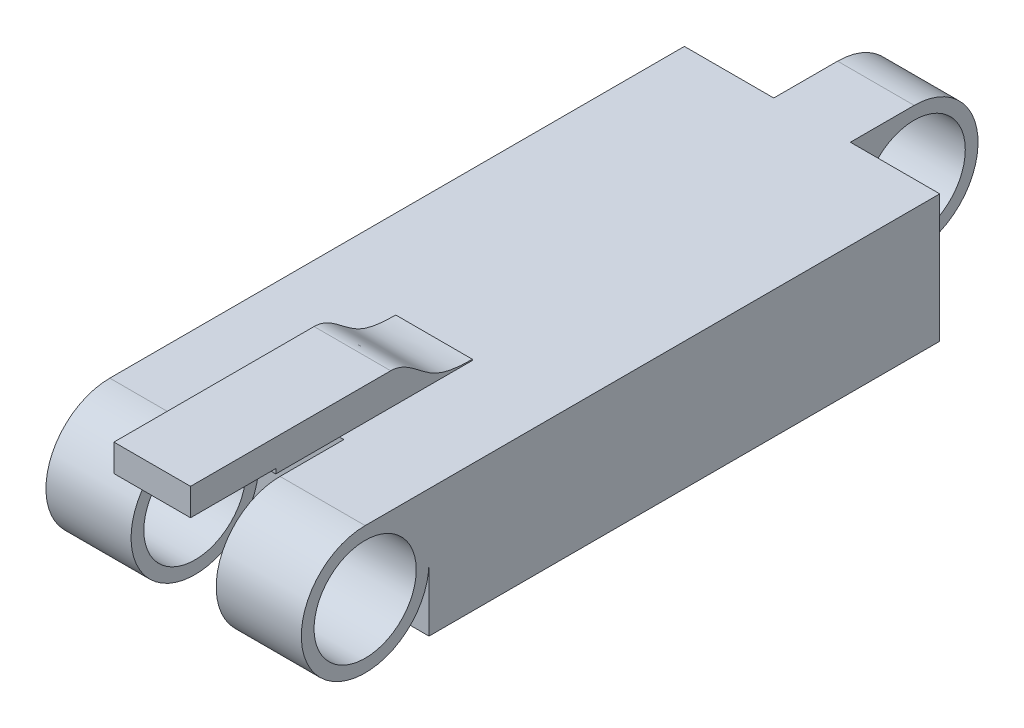
ISO-10303-21;
HEADER;
FILE_DESCRIPTION(('STEP AP214'),'2;1');
FILE_NAME('part.step','',(''),(''),'','','');
FILE_SCHEMA(('AUTOMOTIVE_DESIGN { 1 0 10303 214 1 1 1 1 }'));
ENDSEC;
DATA;
#1=APPLICATION_CONTEXT('core data for automotive mechanical design processes');
#2=APPLICATION_PROTOCOL_DEFINITION('international standard','automotive_design',2000,#1);
#3=PRODUCT_CONTEXT('',#1,'mechanical');
#4=PRODUCT('Part','Part','',(#3));
#5=PRODUCT_RELATED_PRODUCT_CATEGORY('part','',(#4));
#6=PRODUCT_DEFINITION_FORMATION('','',#4);
#7=PRODUCT_DEFINITION_CONTEXT('part definition',#1,'design');
#8=PRODUCT_DEFINITION('design','',#6,#7);
#9=PRODUCT_DEFINITION_SHAPE('','',#8);
#10=(LENGTH_UNIT() NAMED_UNIT(*) SI_UNIT(.MILLI.,.METRE.));
#11=(NAMED_UNIT(*) PLANE_ANGLE_UNIT() SI_UNIT($,.RADIAN.));
#12=(NAMED_UNIT(*) SI_UNIT($,.STERADIAN.) SOLID_ANGLE_UNIT());
#13=UNCERTAINTY_MEASURE_WITH_UNIT(LENGTH_MEASURE(1.E-05),#10,'distance_accuracy_value','');
#14=(GEOMETRIC_REPRESENTATION_CONTEXT(3) GLOBAL_UNCERTAINTY_ASSIGNED_CONTEXT((#13)) GLOBAL_UNIT_ASSIGNED_CONTEXT((#10,
#11,#12)) REPRESENTATION_CONTEXT('',''));
#15=CARTESIAN_POINT('',(0.,0.,0.));
#16=DIRECTION('',(0.,0.,1.));
#17=DIRECTION('',(1.,0.,0.));
#18=AXIS2_PLACEMENT_3D('',#15,#16,#17);
#19=CARTESIAN_POINT('',(10.,5.,0.));
#20=DIRECTION('',(0.,-1.,0.));
#21=DIRECTION('',(0.,0.,-1.));
#22=AXIS2_PLACEMENT_3D('',#19,#20,#21);
#23=PLANE('',#22);
#24=DIRECTION('',(0.,0.,1.));
#25=VECTOR('',#24,1.);
#26=CARTESIAN_POINT('',(3.5,5.,0.));
#27=LINE('',#26,#25);
#28=CARTESIAN_POINT('',(3.5,5.,-5.2));
#29=VERTEX_POINT('',#28);
#30=CARTESIAN_POINT('',(3.5,5.,0.));
#31=VERTEX_POINT('',#30);
#32=EDGE_CURVE('E369',#29,#31,#27,.T.);
#33=ORIENTED_EDGE('',*,*,#32,.F.);
#34=DIRECTION('',(1.,0.,0.));
#35=VECTOR('',#34,1.);
#36=CARTESIAN_POINT('',(3.5,5.,-5.2));
#37=LINE('',#36,#35);
#38=CARTESIAN_POINT('',(6.5,5.,-5.2));
#39=VERTEX_POINT('',#38);
#40=EDGE_CURVE('E203',#29,#39,#37,.T.);
#41=ORIENTED_EDGE('',*,*,#40,.T.);
#42=DIRECTION('',(0.,0.,1.));
#43=VECTOR('',#42,1.);
#44=CARTESIAN_POINT('',(6.5,5.,0.));
#45=LINE('',#44,#43);
#46=CARTESIAN_POINT('',(6.5,5.,0.));
#47=VERTEX_POINT('',#46);
#48=EDGE_CURVE('E365',#39,#47,#45,.T.);
#49=ORIENTED_EDGE('',*,*,#48,.T.);
#50=DIRECTION('',(-1.,0.,0.));
#51=VECTOR('',#50,1.);
#52=CARTESIAN_POINT('',(10.,5.,0.));
#53=LINE('',#52,#51);
#54=CARTESIAN_POINT('',(6.66666666666667,5.,0.));
#55=VERTEX_POINT('',#54);
#56=EDGE_CURVE('E347',#55,#47,#53,.T.);
#57=ORIENTED_EDGE('',*,*,#56,.F.);
#58=DIRECTION('',(0.,0.,1.));
#59=VECTOR('',#58,1.);
#60=CARTESIAN_POINT('',(6.66666666666667,5.,2.5));
#61=LINE('',#60,#59);
#62=CARTESIAN_POINT('',(6.66666666666667,5.,2.5));
#63=VERTEX_POINT('',#62);
#64=EDGE_CURVE('E307',#55,#63,#61,.T.);
#65=ORIENTED_EDGE('',*,*,#64,.T.);
#66=DIRECTION('',(1.,0.,0.));
#67=VECTOR('',#66,1.);
#68=CARTESIAN_POINT('',(6.66666666666667,5.,2.5));
#69=LINE('',#68,#67);
#70=CARTESIAN_POINT('',(10.,5.,2.5));
#71=VERTEX_POINT('',#70);
#72=EDGE_CURVE('E314',#63,#71,#69,.T.);
#73=ORIENTED_EDGE('',*,*,#72,.T.);
#74=DIRECTION('',(0.,0.,1.));
#75=VECTOR('',#74,1.);
#76=CARTESIAN_POINT('',(10.,5.,0.));
#77=LINE('',#76,#75);
#78=CARTESIAN_POINT('',(10.,5.,-20.));
#79=VERTEX_POINT('',#78);
#80=EDGE_CURVE('E332',#79,#71,#77,.T.);
#81=ORIENTED_EDGE('',*,*,#80,.F.);
#82=DIRECTION('',(-1.,0.,0.));
#83=VECTOR('',#82,1.);
#84=CARTESIAN_POINT('',(10.,5.,-20.));
#85=LINE('',#84,#83);
#86=CARTESIAN_POINT('',(6.5,5.,-20.));
#87=VERTEX_POINT('',#86);
#88=EDGE_CURVE('E353',#79,#87,#85,.T.);
#89=ORIENTED_EDGE('',*,*,#88,.T.);
#90=DIRECTION('',(0.,0.,1.));
#91=VECTOR('',#90,1.);
#92=CARTESIAN_POINT('',(6.5,5.,-20.));
#93=LINE('',#92,#91);
#94=CARTESIAN_POINT('',(6.5,5.,-22.5));
#95=VERTEX_POINT('',#94);
#96=EDGE_CURVE('E230',#95,#87,#93,.T.);
#97=ORIENTED_EDGE('',*,*,#96,.F.);
#98=DIRECTION('',(1.,0.,0.));
#99=VECTOR('',#98,1.);
#100=CARTESIAN_POINT('',(3.5,5.,-22.5));
#101=LINE('',#100,#99);
#102=CARTESIAN_POINT('',(3.5,5.,-22.5));
#103=VERTEX_POINT('',#102);
#104=EDGE_CURVE('E252',#103,#95,#101,.T.);
#105=ORIENTED_EDGE('',*,*,#104,.F.);
#106=DIRECTION('',(0.,0.,1.));
#107=VECTOR('',#106,1.);
#108=CARTESIAN_POINT('',(3.5,5.,-20.));
#109=LINE('',#108,#107);
#110=CARTESIAN_POINT('',(3.5,5.,-20.));
#111=VERTEX_POINT('',#110);
#112=EDGE_CURVE('E244',#103,#111,#109,.T.);
#113=ORIENTED_EDGE('',*,*,#112,.T.);
#114=CARTESIAN_POINT('',(0.,5.,-20.));
#115=VERTEX_POINT('',#114);
#116=EDGE_CURVE('E351',#111,#115,#85,.T.);
#117=ORIENTED_EDGE('',*,*,#116,.T.);
#118=DIRECTION('',(0.,0.,1.));
#119=VECTOR('',#118,1.);
#120=CARTESIAN_POINT('',(0.,5.,0.));
#121=LINE('',#120,#119);
#122=CARTESIAN_POINT('',(0.,5.,2.5));
#123=VERTEX_POINT('',#122);
#124=EDGE_CURVE('E326',#115,#123,#121,.T.);
#125=ORIENTED_EDGE('',*,*,#124,.T.);
#126=DIRECTION('',(-1.,0.,0.));
#127=VECTOR('',#126,1.);
#128=CARTESIAN_POINT('',(3.33333333333333,5.,2.5));
#129=LINE('',#128,#127);
#130=CARTESIAN_POINT('',(3.33333333333333,5.,2.5));
#131=VERTEX_POINT('',#130);
#132=EDGE_CURVE('E279',#131,#123,#129,.T.);
#133=ORIENTED_EDGE('',*,*,#132,.F.);
#134=DIRECTION('',(0.,0.,-1.));
#135=VECTOR('',#134,1.);
#136=CARTESIAN_POINT('',(3.33333333333333,5.,2.5));
#137=LINE('',#136,#135);
#138=CARTESIAN_POINT('',(3.33333333333333,5.,0.));
#139=VERTEX_POINT('',#138);
#140=EDGE_CURVE('E272',#131,#139,#137,.T.);
#141=ORIENTED_EDGE('',*,*,#140,.T.);
#142=EDGE_CURVE('E335',#31,#139,#53,.T.);
#143=ORIENTED_EDGE('',*,*,#142,.F.);
#144=EDGE_LOOP('',(#33,#41,#49,#57,#65,#73,#81,#89,#97,#105,#113,#117,#125,#133,#141,#143));
#145=FACE_BOUND('',#144,.T.);
#146=ADVANCED_FACE('F44',(#145),#23,.F.);
#147=CARTESIAN_POINT('',(10.,0.,-20.));
#148=DIRECTION('',(0.,0.,1.));
#149=DIRECTION('',(1.,0.,0.));
#150=AXIS2_PLACEMENT_3D('',#147,#148,#149);
#151=PLANE('',#150);
#152=DIRECTION('',(0.,-1.,0.));
#153=VECTOR('',#152,1.);
#154=CARTESIAN_POINT('',(3.5,5.,-20.));
#155=LINE('',#154,#153);
#156=CARTESIAN_POINT('',(3.5,2.5,-20.));
#157=VERTEX_POINT('',#156);
#158=EDGE_CURVE('E248',#111,#157,#155,.T.);
#159=ORIENTED_EDGE('',*,*,#158,.T.);
#160=DIRECTION('',(1.,0.,0.));
#161=VECTOR('',#160,1.);
#162=CARTESIAN_POINT('',(3.5,2.5,-20.));
#163=LINE('',#162,#161);
#164=CARTESIAN_POINT('',(6.5,2.5,-20.));
#165=VERTEX_POINT('',#164);
#166=EDGE_CURVE('E253',#157,#165,#163,.T.);
#167=ORIENTED_EDGE('',*,*,#166,.T.);
#168=DIRECTION('',(0.,-1.,0.));
#169=VECTOR('',#168,1.);
#170=CARTESIAN_POINT('',(6.5,5.,-20.));
#171=LINE('',#170,#169);
#172=EDGE_CURVE('E233',#87,#165,#171,.T.);
#173=ORIENTED_EDGE('',*,*,#172,.F.);
#174=ORIENTED_EDGE('',*,*,#88,.F.);
#175=DIRECTION('',(0.,1.,0.));
#176=VECTOR('',#175,1.);
#177=CARTESIAN_POINT('',(10.,0.,-20.));
#178=LINE('',#177,#176);
#179=CARTESIAN_POINT('',(10.,0.,-20.));
#180=VERTEX_POINT('',#179);
#181=EDGE_CURVE('E329',#180,#79,#178,.T.);
#182=ORIENTED_EDGE('',*,*,#181,.F.);
#183=DIRECTION('',(-1.,0.,0.));
#184=VECTOR('',#183,1.);
#185=CARTESIAN_POINT('',(10.,0.,-20.));
#186=LINE('',#185,#184);
#187=CARTESIAN_POINT('',(0.,0.,-20.));
#188=VERTEX_POINT('',#187);
#189=EDGE_CURVE('E357',#180,#188,#186,.T.);
#190=ORIENTED_EDGE('',*,*,#189,.T.);
#191=DIRECTION('',(0.,1.,0.));
#192=VECTOR('',#191,1.);
#193=CARTESIAN_POINT('',(0.,0.,-20.));
#194=LINE('',#193,#192);
#195=EDGE_CURVE('E341',#188,#115,#194,.T.);
#196=ORIENTED_EDGE('',*,*,#195,.T.);
#197=ORIENTED_EDGE('',*,*,#116,.F.);
#198=EDGE_LOOP('',(#159,#167,#173,#174,#182,#190,#196,#197));
#199=FACE_BOUND('',#198,.T.);
#200=ADVANCED_FACE('F420',(#199),#151,.F.);
#201=CARTESIAN_POINT('',(10.,0.,0.));
#202=DIRECTION('',(0.,0.,-1.));
#203=DIRECTION('',(-1.,0.,0.));
#204=AXIS2_PLACEMENT_3D('',#201,#202,#203);
#205=PLANE('',#204);
#206=DIRECTION('',(0.,-1.,0.));
#207=VECTOR('',#206,1.);
#208=CARTESIAN_POINT('',(3.33333333333333,5.,0.));
#209=LINE('',#208,#207);
#210=CARTESIAN_POINT('',(3.33333333333333,2.5,0.));
#211=VERTEX_POINT('',#210);
#212=EDGE_CURVE('E276',#139,#211,#209,.T.);
#213=ORIENTED_EDGE('',*,*,#212,.T.);
#214=DIRECTION('',(-1.,0.,0.));
#215=VECTOR('',#214,1.);
#216=CARTESIAN_POINT('',(3.33333333333333,2.5,0.));
#217=LINE('',#216,#215);
#218=CARTESIAN_POINT('',(0.,2.5,0.));
#219=VERTEX_POINT('',#218);
#220=EDGE_CURVE('E283',#211,#219,#217,.T.);
#221=ORIENTED_EDGE('',*,*,#220,.T.);
#222=DIRECTION('',(0.,-1.,0.));
#223=VECTOR('',#222,1.);
#224=CARTESIAN_POINT('',(0.,0.,0.));
#225=LINE('',#224,#223);
#226=CARTESIAN_POINT('',(0.,0.,0.));
#227=VERTEX_POINT('',#226);
#228=EDGE_CURVE('E318',#219,#227,#225,.T.);
#229=ORIENTED_EDGE('',*,*,#228,.T.);
#230=DIRECTION('',(-1.,0.,0.));
#231=VECTOR('',#230,1.);
#232=CARTESIAN_POINT('',(10.,0.,0.));
#233=LINE('',#232,#231);
#234=CARTESIAN_POINT('',(10.,0.,0.));
#235=VERTEX_POINT('',#234);
#236=EDGE_CURVE('E361',#235,#227,#233,.T.);
#237=ORIENTED_EDGE('',*,*,#236,.F.);
#238=DIRECTION('',(0.,-1.,0.));
#239=VECTOR('',#238,1.);
#240=CARTESIAN_POINT('',(10.,0.,0.));
#241=LINE('',#240,#239);
#242=CARTESIAN_POINT('',(10.,2.5,0.));
#243=VERTEX_POINT('',#242);
#244=EDGE_CURVE('E322',#243,#235,#241,.T.);
#245=ORIENTED_EDGE('',*,*,#244,.F.);
#246=DIRECTION('',(1.,0.,0.));
#247=VECTOR('',#246,1.);
#248=CARTESIAN_POINT('',(6.66666666666667,2.5,0.));
#249=LINE('',#248,#247);
#250=CARTESIAN_POINT('',(6.66666666666667,2.5,0.));
#251=VERTEX_POINT('',#250);
#252=EDGE_CURVE('E311',#251,#243,#249,.T.);
#253=ORIENTED_EDGE('',*,*,#252,.F.);
#254=DIRECTION('',(0.,1.,0.));
#255=VECTOR('',#254,1.);
#256=CARTESIAN_POINT('',(6.66666666666667,5.,0.));
#257=LINE('',#256,#255);
#258=EDGE_CURVE('E303',#251,#55,#257,.T.);
#259=ORIENTED_EDGE('',*,*,#258,.T.);
#260=ORIENTED_EDGE('',*,*,#56,.T.);
#261=EDGE_CURVE('E352',#47,#31,#53,.T.);
#262=ORIENTED_EDGE('',*,*,#261,.T.);
#263=ORIENTED_EDGE('',*,*,#142,.T.);
#264=EDGE_LOOP('',(#213,#221,#229,#237,#245,#253,#259,#260,#262,#263));
#265=FACE_BOUND('',#264,.T.);
#266=ADVANCED_FACE('F46',(#265),#205,.F.);
#267=CARTESIAN_POINT('',(10.,0.,0.));
#268=DIRECTION('',(0.,1.,0.));
#269=DIRECTION('',(0.,0.,1.));
#270=AXIS2_PLACEMENT_3D('',#267,#268,#269);
#271=PLANE('',#270);
#272=DIRECTION('',(0.,0.,-1.));
#273=VECTOR('',#272,1.);
#274=CARTESIAN_POINT('',(0.,0.,0.));
#275=LINE('',#274,#273);
#276=EDGE_CURVE('E338',#227,#188,#275,.T.);
#277=ORIENTED_EDGE('',*,*,#276,.T.);
#278=ORIENTED_EDGE('',*,*,#189,.F.);
#279=DIRECTION('',(0.,0.,-1.));
#280=VECTOR('',#279,1.);
#281=CARTESIAN_POINT('',(10.,0.,0.));
#282=LINE('',#281,#280);
#283=EDGE_CURVE('E325',#235,#180,#282,.T.);
#284=ORIENTED_EDGE('',*,*,#283,.F.);
#285=ORIENTED_EDGE('',*,*,#236,.T.);
#286=EDGE_LOOP('',(#277,#278,#284,#285));
#287=FACE_BOUND('',#286,.T.);
#288=ADVANCED_FACE('F438',(#287),#271,.F.);
#289=CARTESIAN_POINT('',(10.,0.,0.));
#290=DIRECTION('',(-1.,0.,0.));
#291=DIRECTION('',(0.,0.,1.));
#292=AXIS2_PLACEMENT_3D('',#289,#290,#291);
#293=PLANE('',#292);
#294=ORIENTED_EDGE('',*,*,#80,.T.);
#295=CARTESIAN_POINT('',(10.,2.5,2.5));
#296=DIRECTION('',(1.,0.,0.));
#297=DIRECTION('',(0.,0.,-1.));
#298=AXIS2_PLACEMENT_3D('',#295,#296,#297);
#299=CIRCLE('',#298,2.5);
#300=EDGE_CURVE('E295',#71,#243,#299,.T.);
#301=ORIENTED_EDGE('',*,*,#300,.T.);
#302=ORIENTED_EDGE('',*,*,#244,.T.);
#303=ORIENTED_EDGE('',*,*,#283,.T.);
#304=ORIENTED_EDGE('',*,*,#181,.T.);
#305=EDGE_LOOP('',(#294,#301,#302,#303,#304));
#306=FACE_BOUND('',#305,.T.);
#307=CARTESIAN_POINT('',(10.,2.5,2.5));
#308=DIRECTION('',(1.,0.,0.));
#309=DIRECTION('',(0.,0.,-1.));
#310=AXIS2_PLACEMENT_3D('',#307,#308,#309);
#311=CIRCLE('',#310,2.);
#312=CARTESIAN_POINT('',(10.,2.5,0.5));
#313=VERTEX_POINT('',#312);
#314=EDGE_CURVE('E287',#313,#313,#311,.T.);
#315=ORIENTED_EDGE('',*,*,#314,.F.);
#316=EDGE_LOOP('',(#315));
#317=FACE_BOUND('',#316,.T.);
#318=ADVANCED_FACE('F440',(#306,#317),#293,.F.);
#319=CARTESIAN_POINT('',(0.,0.,0.));
#320=DIRECTION('',(-1.,0.,0.));
#321=DIRECTION('',(0.,0.,1.));
#322=AXIS2_PLACEMENT_3D('',#319,#320,#321);
#323=PLANE('',#322);
#324=ORIENTED_EDGE('',*,*,#228,.F.);
#325=CARTESIAN_POINT('',(0.,2.5,2.5));
#326=DIRECTION('',(-1.,0.,0.));
#327=DIRECTION('',(0.,0.,1.));
#328=AXIS2_PLACEMENT_3D('',#325,#326,#327);
#329=CIRCLE('',#328,2.5);
#330=EDGE_CURVE('E264',#219,#123,#329,.T.);
#331=ORIENTED_EDGE('',*,*,#330,.T.);
#332=ORIENTED_EDGE('',*,*,#124,.F.);
#333=ORIENTED_EDGE('',*,*,#195,.F.);
#334=ORIENTED_EDGE('',*,*,#276,.F.);
#335=EDGE_LOOP('',(#324,#331,#332,#333,#334));
#336=FACE_BOUND('',#335,.T.);
#337=CARTESIAN_POINT('',(0.,2.5,2.5));
#338=DIRECTION('',(-1.,0.,0.));
#339=DIRECTION('',(0.,0.,1.));
#340=AXIS2_PLACEMENT_3D('',#337,#338,#339);
#341=CIRCLE('',#340,2.);
#342=CARTESIAN_POINT('',(0.,2.5,4.5));
#343=VERTEX_POINT('',#342);
#344=EDGE_CURVE('E257',#343,#343,#341,.T.);
#345=ORIENTED_EDGE('',*,*,#344,.F.);
#346=EDGE_LOOP('',(#345));
#347=FACE_BOUND('',#346,.T.);
#348=ADVANCED_FACE('F425',(#336,#347),#323,.T.);
#349=CARTESIAN_POINT('',(6.66666666666667,2.5,2.5));
#350=DIRECTION('',(1.,0.,0.));
#351=DIRECTION('',(0.,0.,-1.));
#352=AXIS2_PLACEMENT_3D('',#349,#350,#351);
#353=CYLINDRICAL_SURFACE('',#352,2.5);
#354=ORIENTED_EDGE('',*,*,#300,.F.);
#355=ORIENTED_EDGE('',*,*,#72,.F.);
#356=CARTESIAN_POINT('',(6.66666666666667,2.5,2.5));
#357=DIRECTION('',(1.,0.,0.));
#358=DIRECTION('',(0.,0.,-1.));
#359=AXIS2_PLACEMENT_3D('',#356,#357,#358);
#360=CIRCLE('',#359,2.5);
#361=EDGE_CURVE('E299',#63,#251,#360,.T.);
#362=ORIENTED_EDGE('',*,*,#361,.T.);
#363=ORIENTED_EDGE('',*,*,#252,.T.);
#364=EDGE_LOOP('',(#354,#355,#362,#363));
#365=FACE_BOUND('',#364,.T.);
#366=ADVANCED_FACE('F446',(#365),#353,.T.);
#367=CARTESIAN_POINT('',(6.66666666666667,2.5,2.5));
#368=DIRECTION('',(1.,0.,0.));
#369=DIRECTION('',(0.,0.,-1.));
#370=AXIS2_PLACEMENT_3D('',#367,#368,#369);
#371=PLANE('',#370);
#372=CARTESIAN_POINT('',(6.66666666666667,2.5,2.5));
#373=DIRECTION('',(1.,0.,0.));
#374=DIRECTION('',(0.,0.,-1.));
#375=AXIS2_PLACEMENT_3D('',#372,#373,#374);
#376=CIRCLE('',#375,2.);
#377=CARTESIAN_POINT('',(6.66666666666667,2.5,0.5));
#378=VERTEX_POINT('',#377);
#379=EDGE_CURVE('E291',#378,#378,#376,.T.);
#380=ORIENTED_EDGE('',*,*,#379,.T.);
#381=EDGE_LOOP('',(#380));
#382=FACE_BOUND('',#381,.T.);
#383=ORIENTED_EDGE('',*,*,#361,.F.);
#384=ORIENTED_EDGE('',*,*,#64,.F.);
#385=ORIENTED_EDGE('',*,*,#258,.F.);
#386=EDGE_LOOP('',(#383,#384,#385));
#387=FACE_BOUND('',#386,.T.);
#388=ADVANCED_FACE('F449',(#382,#387),#371,.F.);
#389=CARTESIAN_POINT('',(6.66666666666667,2.5,2.5));
#390=DIRECTION('',(1.,0.,0.));
#391=DIRECTION('',(0.,0.,-1.));
#392=AXIS2_PLACEMENT_3D('',#389,#390,#391);
#393=CYLINDRICAL_SURFACE('',#392,2.);
#394=CARTESIAN_POINT('',(6.66666666666667,2.5,0.5));
#395=CARTESIAN_POINT('',(6.70138888888889,2.5,0.5));
#396=CARTESIAN_POINT('',(6.73611111111111,2.5,0.5));
#397=CARTESIAN_POINT('',(6.80555555555556,2.5,0.5));
#398=CARTESIAN_POINT('',(6.84027777777778,2.5,0.5));
#399=CARTESIAN_POINT('',(6.90972222222222,2.5,0.5));
#400=CARTESIAN_POINT('',(6.94444444444444,2.5,0.5));
#401=CARTESIAN_POINT('',(7.01388888888889,2.5,0.5));
#402=CARTESIAN_POINT('',(7.04861111111111,2.5,0.5));
#403=CARTESIAN_POINT('',(7.11805555555556,2.5,0.5));
#404=CARTESIAN_POINT('',(7.15277777777778,2.5,0.5));
#405=CARTESIAN_POINT('',(7.22222222222222,2.5,0.5));
#406=CARTESIAN_POINT('',(7.25694444444444,2.5,0.5));
#407=CARTESIAN_POINT('',(7.32638888888889,2.5,0.5));
#408=CARTESIAN_POINT('',(7.36111111111111,2.5,0.5));
#409=CARTESIAN_POINT('',(7.43055555555556,2.5,0.5));
#410=CARTESIAN_POINT('',(7.46527777777778,2.5,0.5));
#411=CARTESIAN_POINT('',(7.53472222222222,2.5,0.5));
#412=CARTESIAN_POINT('',(7.56944444444444,2.5,0.5));
#413=CARTESIAN_POINT('',(7.63888888888889,2.5,0.5));
#414=CARTESIAN_POINT('',(7.67361111111111,2.5,0.5));
#415=CARTESIAN_POINT('',(7.74305555555556,2.5,0.5));
#416=CARTESIAN_POINT('',(7.77777777777778,2.5,0.5));
#417=CARTESIAN_POINT('',(7.84722222222222,2.5,0.5));
#418=CARTESIAN_POINT('',(7.88194444444444,2.5,0.5));
#419=CARTESIAN_POINT('',(7.95138888888889,2.5,0.5));
#420=CARTESIAN_POINT('',(7.98611111111111,2.5,0.5));
#421=CARTESIAN_POINT('',(8.05555555555556,2.5,0.5));
#422=CARTESIAN_POINT('',(8.09027777777778,2.5,0.5));
#423=CARTESIAN_POINT('',(8.15972222222222,2.5,0.5));
#424=CARTESIAN_POINT('',(8.19444444444444,2.5,0.5));
#425=CARTESIAN_POINT('',(8.26388888888889,2.5,0.5));
#426=CARTESIAN_POINT('',(8.29861111111111,2.5,0.5));
#427=CARTESIAN_POINT('',(8.36805555555556,2.5,0.5));
#428=CARTESIAN_POINT('',(8.40277777777778,2.5,0.5));
#429=CARTESIAN_POINT('',(8.47222222222222,2.5,0.5));
#430=CARTESIAN_POINT('',(8.50694444444444,2.5,0.5));
#431=CARTESIAN_POINT('',(8.57638888888889,2.5,0.5));
#432=CARTESIAN_POINT('',(8.61111111111111,2.5,0.5));
#433=CARTESIAN_POINT('',(8.68055555555556,2.5,0.5));
#434=CARTESIAN_POINT('',(8.71527777777778,2.5,0.5));
#435=CARTESIAN_POINT('',(8.78472222222222,2.5,0.5));
#436=CARTESIAN_POINT('',(8.81944444444444,2.5,0.5));
#437=CARTESIAN_POINT('',(8.88888888888889,2.5,0.5));
#438=CARTESIAN_POINT('',(8.92361111111111,2.5,0.5));
#439=CARTESIAN_POINT('',(8.99305555555556,2.5,0.5));
#440=CARTESIAN_POINT('',(9.02777777777778,2.5,0.5));
#441=CARTESIAN_POINT('',(9.09722222222222,2.5,0.5));
#442=CARTESIAN_POINT('',(9.13194444444444,2.5,0.5));
#443=CARTESIAN_POINT('',(9.20138888888889,2.5,0.5));
#444=CARTESIAN_POINT('',(9.23611111111111,2.5,0.5));
#445=CARTESIAN_POINT('',(9.30555555555556,2.5,0.5));
#446=CARTESIAN_POINT('',(9.34027777777778,2.5,0.5));
#447=CARTESIAN_POINT('',(9.40972222222222,2.5,0.5));
#448=CARTESIAN_POINT('',(9.44444444444444,2.5,0.5));
#449=CARTESIAN_POINT('',(9.51388888888889,2.5,0.5));
#450=CARTESIAN_POINT('',(9.54861111111111,2.5,0.5));
#451=CARTESIAN_POINT('',(9.61805555555556,2.5,0.5));
#452=CARTESIAN_POINT('',(9.65277777777778,2.5,0.5));
#453=CARTESIAN_POINT('',(9.72222222222222,2.5,0.5));
#454=CARTESIAN_POINT('',(9.75694444444444,2.5,0.5));
#455=CARTESIAN_POINT('',(9.82638888888889,2.5,0.5));
#456=CARTESIAN_POINT('',(9.86111111111111,2.5,0.5));
#457=CARTESIAN_POINT('',(9.93055555555556,2.5,0.5));
#458=CARTESIAN_POINT('',(9.96527777777778,2.5,0.5));
#459=CARTESIAN_POINT('',(10.,2.5,0.5));
#460=B_SPLINE_CURVE_WITH_KNOTS('',3,(#394,#395,#396,#397,#398,#399,#400,#401,#402,#403,#404,
#405,#406,#407,#408,#409,#410,#411,#412,#413,#414,#415,#416,#417,#418,#419,#420,#421,#422,#423,
#424,#425,#426,#427,#428,#429,#430,#431,#432,#433,#434,#435,#436,#437,#438,#439,#440,#441,#442,
#443,#444,#445,#446,#447,#448,#449,#450,#451,#452,#453,#454,#455,#456,#457,#458,#459),
.UNSPECIFIED.,.F.,.F.,(4,2,2,2,2,2,2,2,2,2,2,2,2,2,2,2,2,2,2,2,2,2,2,2,2,2,2,2,2,2,2,2,4),(0.,
0.104166666666666,0.208333333333333,0.312499999999999,0.416666666666666,0.520833333333332,0.625,
0.729166666666666,0.833333333333333,0.9375,1.04166666666667,1.14583333333333,1.25,
1.35416666666667,1.45833333333333,1.5625,1.66666666666667,1.77083333333333,1.875,
1.97916666666667,2.08333333333333,2.1875,2.29166666666666,2.39583333333333,2.5,2.60416666666667,
2.70833333333333,2.8125,2.91666666666667,3.02083333333333,3.125,3.22916666666667,
3.33333333333333),.UNSPECIFIED.);
#461=EDGE_CURVE('BSEAM640',#378,#313,#460,.T.);
#462=ORIENTED_EDGE('',*,*,#379,.F.);
#463=ORIENTED_EDGE('',*,*,#314,.T.);
#464=ORIENTED_EDGE('',*,*,#461,.T.);
#465=ORIENTED_EDGE('',*,*,#461,.F.);
#466=EDGE_LOOP('',(#462,#464,#463,#465));
#467=FACE_BOUND('',#466,.T.);
#468=ADVANCED_FACE('F640',(#467),#393,.F.);
#469=CARTESIAN_POINT('',(3.33333333333333,2.5,2.5));
#470=DIRECTION('',(-1.,0.,0.));
#471=DIRECTION('',(0.,0.,1.));
#472=AXIS2_PLACEMENT_3D('',#469,#470,#471);
#473=CYLINDRICAL_SURFACE('',#472,2.5);
#474=ORIENTED_EDGE('',*,*,#330,.F.);
#475=ORIENTED_EDGE('',*,*,#220,.F.);
#476=CARTESIAN_POINT('',(3.33333333333333,2.5,2.5));
#477=DIRECTION('',(-1.,0.,0.));
#478=DIRECTION('',(0.,0.,1.));
#479=AXIS2_PLACEMENT_3D('',#476,#477,#478);
#480=CIRCLE('',#479,2.5);
#481=EDGE_CURVE('E268',#211,#131,#480,.T.);
#482=ORIENTED_EDGE('',*,*,#481,.T.);
#483=ORIENTED_EDGE('',*,*,#132,.T.);
#484=EDGE_LOOP('',(#474,#475,#482,#483));
#485=FACE_BOUND('',#484,.T.);
#486=ADVANCED_FACE('F430',(#485),#473,.T.);
#487=CARTESIAN_POINT('',(3.33333333333333,2.5,2.5));
#488=DIRECTION('',(-1.,0.,0.));
#489=DIRECTION('',(0.,0.,1.));
#490=AXIS2_PLACEMENT_3D('',#487,#488,#489);
#491=PLANE('',#490);
#492=CARTESIAN_POINT('',(3.33333333333333,2.5,2.5));
#493=DIRECTION('',(-1.,0.,0.));
#494=DIRECTION('',(0.,0.,1.));
#495=AXIS2_PLACEMENT_3D('',#492,#493,#494);
#496=CIRCLE('',#495,2.);
#497=CARTESIAN_POINT('',(3.33333333333333,2.5,4.5));
#498=VERTEX_POINT('',#497);
#499=EDGE_CURVE('E260',#498,#498,#496,.T.);
#500=ORIENTED_EDGE('',*,*,#499,.T.);
#501=EDGE_LOOP('',(#500));
#502=FACE_BOUND('',#501,.T.);
#503=ORIENTED_EDGE('',*,*,#481,.F.);
#504=ORIENTED_EDGE('',*,*,#212,.F.);
#505=ORIENTED_EDGE('',*,*,#140,.F.);
#506=EDGE_LOOP('',(#503,#504,#505));
#507=FACE_BOUND('',#506,.T.);
#508=ADVANCED_FACE('F433',(#502,#507),#491,.F.);
#509=CARTESIAN_POINT('',(3.33333333333333,2.5,2.5));
#510=DIRECTION('',(-1.,0.,0.));
#511=DIRECTION('',(0.,0.,1.));
#512=AXIS2_PLACEMENT_3D('',#509,#510,#511);
#513=CYLINDRICAL_SURFACE('',#512,2.);
#514=CARTESIAN_POINT('',(3.33333333333333,2.5,4.5));
#515=CARTESIAN_POINT('',(3.29861111111111,2.5,4.5));
#516=CARTESIAN_POINT('',(3.26388888888889,2.5,4.5));
#517=CARTESIAN_POINT('',(3.19444444444444,2.5,4.5));
#518=CARTESIAN_POINT('',(3.15972222222222,2.5,4.5));
#519=CARTESIAN_POINT('',(3.09027777777778,2.5,4.5));
#520=CARTESIAN_POINT('',(3.05555555555556,2.5,4.5));
#521=CARTESIAN_POINT('',(2.98611111111111,2.5,4.5));
#522=CARTESIAN_POINT('',(2.95138888888889,2.5,4.5));
#523=CARTESIAN_POINT('',(2.88194444444444,2.5,4.5));
#524=CARTESIAN_POINT('',(2.84722222222222,2.5,4.5));
#525=CARTESIAN_POINT('',(2.77777777777778,2.5,4.5));
#526=CARTESIAN_POINT('',(2.74305555555556,2.5,4.5));
#527=CARTESIAN_POINT('',(2.67361111111111,2.5,4.5));
#528=CARTESIAN_POINT('',(2.63888888888889,2.5,4.5));
#529=CARTESIAN_POINT('',(2.56944444444444,2.5,4.5));
#530=CARTESIAN_POINT('',(2.53472222222222,2.5,4.5));
#531=CARTESIAN_POINT('',(2.46527777777778,2.5,4.5));
#532=CARTESIAN_POINT('',(2.43055555555556,2.5,4.5));
#533=CARTESIAN_POINT('',(2.36111111111111,2.5,4.5));
#534=CARTESIAN_POINT('',(2.32638888888889,2.5,4.5));
#535=CARTESIAN_POINT('',(2.25694444444444,2.5,4.5));
#536=CARTESIAN_POINT('',(2.22222222222222,2.5,4.5));
#537=CARTESIAN_POINT('',(2.15277777777778,2.5,4.5));
#538=CARTESIAN_POINT('',(2.11805555555556,2.5,4.5));
#539=CARTESIAN_POINT('',(2.04861111111111,2.5,4.5));
#540=CARTESIAN_POINT('',(2.01388888888889,2.5,4.5));
#541=CARTESIAN_POINT('',(1.94444444444445,2.5,4.5));
#542=CARTESIAN_POINT('',(1.90972222222222,2.5,4.5));
#543=CARTESIAN_POINT('',(1.84027777777778,2.5,4.5));
#544=CARTESIAN_POINT('',(1.80555555555556,2.5,4.5));
#545=CARTESIAN_POINT('',(1.73611111111111,2.5,4.5));
#546=CARTESIAN_POINT('',(1.70138888888889,2.5,4.5));
#547=CARTESIAN_POINT('',(1.63194444444444,2.5,4.5));
#548=CARTESIAN_POINT('',(1.59722222222222,2.5,4.5));
#549=CARTESIAN_POINT('',(1.52777777777778,2.5,4.5));
#550=CARTESIAN_POINT('',(1.49305555555556,2.5,4.5));
#551=CARTESIAN_POINT('',(1.42361111111111,2.5,4.5));
#552=CARTESIAN_POINT('',(1.38888888888889,2.5,4.5));
#553=CARTESIAN_POINT('',(1.31944444444444,2.5,4.5));
#554=CARTESIAN_POINT('',(1.28472222222222,2.5,4.5));
#555=CARTESIAN_POINT('',(1.21527777777778,2.5,4.5));
#556=CARTESIAN_POINT('',(1.18055555555556,2.5,4.5));
#557=CARTESIAN_POINT('',(1.11111111111111,2.5,4.5));
#558=CARTESIAN_POINT('',(1.07638888888889,2.5,4.5));
#559=CARTESIAN_POINT('',(1.00694444444444,2.5,4.5));
#560=CARTESIAN_POINT('',(0.972222222222223,2.5,4.5));
#561=CARTESIAN_POINT('',(0.902777777777778,2.5,4.5));
#562=CARTESIAN_POINT('',(0.868055555555556,2.5,4.5));
#563=CARTESIAN_POINT('',(0.798611111111112,2.5,4.5));
#564=CARTESIAN_POINT('',(0.763888888888889,2.5,4.5));
#565=CARTESIAN_POINT('',(0.694444444444445,2.5,4.5));
#566=CARTESIAN_POINT('',(0.659722222222223,2.5,4.5));
#567=CARTESIAN_POINT('',(0.590277777777778,2.5,4.5));
#568=CARTESIAN_POINT('',(0.555555555555556,2.5,4.5));
#569=CARTESIAN_POINT('',(0.486111111111112,2.5,4.5));
#570=CARTESIAN_POINT('',(0.451388888888889,2.5,4.5));
#571=CARTESIAN_POINT('',(0.381944444444445,2.5,4.5));
#572=CARTESIAN_POINT('',(0.347222222222223,2.5,4.5));
#573=CARTESIAN_POINT('',(0.277777777777778,2.5,4.5));
#574=CARTESIAN_POINT('',(0.243055555555556,2.5,4.5));
#575=CARTESIAN_POINT('',(0.173611111111111,2.5,4.5));
#576=CARTESIAN_POINT('',(0.138888888888889,2.5,4.5));
#577=CARTESIAN_POINT('',(0.0694444444444448,2.5,4.5));
#578=CARTESIAN_POINT('',(0.0347222222222226,2.5,4.5));
#579=CARTESIAN_POINT('',(0.,2.5,4.5));
#580=B_SPLINE_CURVE_WITH_KNOTS('',3,(#514,#515,#516,#517,#518,#519,#520,#521,#522,#523,#524,
#525,#526,#527,#528,#529,#530,#531,#532,#533,#534,#535,#536,#537,#538,#539,#540,#541,#542,#543,
#544,#545,#546,#547,#548,#549,#550,#551,#552,#553,#554,#555,#556,#557,#558,#559,#560,#561,#562,
#563,#564,#565,#566,#567,#568,#569,#570,#571,#572,#573,#574,#575,#576,#577,#578,#579),
.UNSPECIFIED.,.F.,.F.,(4,2,2,2,2,2,2,2,2,2,2,2,2,2,2,2,2,2,2,2,2,2,2,2,2,2,2,2,2,2,2,2,4),(0.,
0.104166666666666,0.208333333333333,0.3125,0.416666666666666,0.520833333333333,0.625,
0.729166666666666,0.833333333333333,0.9375,1.04166666666667,1.14583333333333,1.25,
1.35416666666667,1.45833333333333,1.5625,1.66666666666667,1.77083333333333,1.875,
1.97916666666667,2.08333333333333,2.1875,2.29166666666667,2.39583333333333,2.5,2.60416666666667,
2.70833333333333,2.8125,2.91666666666667,3.02083333333333,3.125,3.22916666666667,
3.33333333333333),.UNSPECIFIED.);
#581=EDGE_CURVE('BSEAM609',#498,#343,#580,.T.);
#582=ORIENTED_EDGE('',*,*,#499,.F.);
#583=ORIENTED_EDGE('',*,*,#344,.T.);
#584=ORIENTED_EDGE('',*,*,#581,.T.);
#585=ORIENTED_EDGE('',*,*,#581,.F.);
#586=EDGE_LOOP('',(#582,#584,#583,#585));
#587=FACE_BOUND('',#586,.T.);
#588=ADVANCED_FACE('F609',(#587),#513,.F.);
#589=CARTESIAN_POINT('',(3.5,2.5,-22.5));
#590=DIRECTION('',(1.,0.,0.));
#591=DIRECTION('',(0.,0.,-1.));
#592=AXIS2_PLACEMENT_3D('',#589,#590,#591);
#593=CYLINDRICAL_SURFACE('',#592,2.5);
#594=ORIENTED_EDGE('',*,*,#104,.T.);
#595=CARTESIAN_POINT('',(6.5,2.5,-22.5));
#596=DIRECTION('',(1.,0.,0.));
#597=DIRECTION('',(0.,0.,-1.));
#598=AXIS2_PLACEMENT_3D('',#595,#596,#597);
#599=CIRCLE('',#598,2.5);
#600=EDGE_CURVE('E226',#165,#95,#599,.T.);
#601=ORIENTED_EDGE('',*,*,#600,.F.);
#602=ORIENTED_EDGE('',*,*,#166,.F.);
#603=CARTESIAN_POINT('',(3.5,2.5,-22.5));
#604=DIRECTION('',(1.,0.,0.));
#605=DIRECTION('',(0.,0.,-1.));
#606=AXIS2_PLACEMENT_3D('',#603,#604,#605);
#607=CIRCLE('',#606,2.5);
#608=EDGE_CURVE('E240',#157,#103,#607,.T.);
#609=ORIENTED_EDGE('',*,*,#608,.T.);
#610=EDGE_LOOP('',(#594,#601,#602,#609));
#611=FACE_BOUND('',#610,.T.);
#612=ADVANCED_FACE('F600',(#611),#593,.T.);
#613=CARTESIAN_POINT('',(3.5,2.5,-22.5));
#614=DIRECTION('',(1.,0.,0.));
#615=DIRECTION('',(0.,0.,-1.));
#616=AXIS2_PLACEMENT_3D('',#613,#614,#615);
#617=PLANE('',#616);
#618=CARTESIAN_POINT('',(3.5,2.5,-22.5));
#619=DIRECTION('',(1.,0.,0.));
#620=DIRECTION('',(0.,0.,-1.));
#621=AXIS2_PLACEMENT_3D('',#618,#619,#620);
#622=CIRCLE('',#621,2.);
#623=CARTESIAN_POINT('',(3.5,2.5,-24.5));
#624=VERTEX_POINT('',#623);
#625=EDGE_CURVE('E236',#624,#624,#622,.T.);
#626=ORIENTED_EDGE('',*,*,#625,.T.);
#627=EDGE_LOOP('',(#626));
#628=FACE_BOUND('',#627,.T.);
#629=ORIENTED_EDGE('',*,*,#608,.F.);
#630=ORIENTED_EDGE('',*,*,#158,.F.);
#631=ORIENTED_EDGE('',*,*,#112,.F.);
#632=EDGE_LOOP('',(#629,#630,#631));
#633=FACE_BOUND('',#632,.T.);
#634=ADVANCED_FACE('F591',(#628,#633),#617,.F.);
#635=CARTESIAN_POINT('',(3.5,2.5,-22.5));
#636=DIRECTION('',(1.,0.,0.));
#637=DIRECTION('',(0.,0.,-1.));
#638=AXIS2_PLACEMENT_3D('',#635,#636,#637);
#639=CYLINDRICAL_SURFACE('',#638,2.);
#640=ORIENTED_EDGE('',*,*,#625,.F.);
#641=EDGE_LOOP('',(#640));
#642=FACE_BOUND('',#641,.T.);
#643=CARTESIAN_POINT('',(6.5,2.5,-22.5));
#644=DIRECTION('',(1.,0.,0.));
#645=DIRECTION('',(0.,0.,-1.));
#646=AXIS2_PLACEMENT_3D('',#643,#644,#645);
#647=CIRCLE('',#646,2.);
#648=CARTESIAN_POINT('',(6.5,2.5,-24.5));
#649=VERTEX_POINT('',#648);
#650=EDGE_CURVE('E220',#649,#649,#647,.T.);
#651=ORIENTED_EDGE('',*,*,#650,.T.);
#652=EDGE_LOOP('',(#651));
#653=FACE_BOUND('',#652,.T.);
#654=ADVANCED_FACE('F479',(#642,#653),#639,.F.);
#655=CARTESIAN_POINT('',(6.5,2.5,-22.5));
#656=DIRECTION('',(1.,0.,0.));
#657=DIRECTION('',(0.,0.,-1.));
#658=AXIS2_PLACEMENT_3D('',#655,#656,#657);
#659=PLANE('',#658);
#660=ORIENTED_EDGE('',*,*,#600,.T.);
#661=ORIENTED_EDGE('',*,*,#96,.T.);
#662=ORIENTED_EDGE('',*,*,#172,.T.);
#663=EDGE_LOOP('',(#660,#661,#662));
#664=FACE_BOUND('',#663,.T.);
#665=ORIENTED_EDGE('',*,*,#650,.F.);
#666=EDGE_LOOP('',(#665));
#667=FACE_BOUND('',#666,.T.);
#668=ADVANCED_FACE('F470',(#664,#667),#659,.T.);
#669=CARTESIAN_POINT('',(3.5,5.,-2.));
#670=DIRECTION('',(0.,-1.,0.));
#671=DIRECTION('',(0.,0.,-1.));
#672=AXIS2_PLACEMENT_3D('',#669,#670,#671);
#673=PLANE('',#672);
#674=DIRECTION('',(-1.,0.,0.));
#675=VECTOR('',#674,1.);
#676=CARTESIAN_POINT('',(10.,5.,2.5));
#677=LINE('',#676,#675);
#678=CARTESIAN_POINT('',(6.5,5.,2.5));
#679=VERTEX_POINT('',#678);
#680=CARTESIAN_POINT('',(3.5,5.,2.5));
#681=VERTEX_POINT('',#680);
#682=EDGE_CURVE('E453',#679,#681,#677,.T.);
#683=ORIENTED_EDGE('',*,*,#682,.T.);
#684=DIRECTION('',(0.,0.,-1.));
#685=VECTOR('',#684,1.);
#686=CARTESIAN_POINT('',(3.5,5.,0.));
#687=LINE('',#686,#685);
#688=EDGE_CURVE('E387',#681,#31,#687,.T.);
#689=ORIENTED_EDGE('',*,*,#688,.T.);
#690=ORIENTED_EDGE('',*,*,#261,.F.);
#691=DIRECTION('',(0.,0.,-1.));
#692=VECTOR('',#691,1.);
#693=CARTESIAN_POINT('',(6.5,5.,0.));
#694=LINE('',#693,#692);
#695=EDGE_CURVE('E68',#679,#47,#694,.T.);
#696=ORIENTED_EDGE('',*,*,#695,.F.);
#697=EDGE_LOOP('',(#683,#689,#690,#696));
#698=FACE_BOUND('',#697,.T.);
#699=ADVANCED_FACE('F468',(#698),#673,.T.);
#700=CARTESIAN_POINT('',(3.5,6.25,8.));
#701=DIRECTION('',(0.,1.,0.));
#702=DIRECTION('',(0.,0.,1.));
#703=AXIS2_PLACEMENT_3D('',#700,#701,#702);
#704=PLANE('',#703);
#705=DIRECTION('',(-1.,0.,0.));
#706=VECTOR('',#705,1.);
#707=CARTESIAN_POINT('',(10.,6.25,5.83802410715979));
#708=LINE('',#707,#706);
#709=CARTESIAN_POINT('',(6.5,6.25,5.83802410715979));
#710=VERTEX_POINT('',#709);
#711=CARTESIAN_POINT('',(3.5,6.25,5.83802410715979));
#712=VERTEX_POINT('',#711);
#713=EDGE_CURVE('E174',#710,#712,#708,.T.);
#714=ORIENTED_EDGE('',*,*,#713,.F.);
#715=DIRECTION('',(0.,0.,1.));
#716=VECTOR('',#715,1.);
#717=CARTESIAN_POINT('',(6.5,6.25,8.));
#718=LINE('',#717,#716);
#719=CARTESIAN_POINT('',(6.5,6.25,-2.));
#720=VERTEX_POINT('',#719);
#721=EDGE_CURVE('E382',#720,#710,#718,.T.);
#722=ORIENTED_EDGE('',*,*,#721,.F.);
#723=DIRECTION('',(1.,0.,0.));
#724=VECTOR('',#723,1.);
#725=CARTESIAN_POINT('',(3.5,6.25,-2.));
#726=LINE('',#725,#724);
#727=CARTESIAN_POINT('',(3.5,6.25,-2.));
#728=VERTEX_POINT('',#727);
#729=EDGE_CURVE('E201',#728,#720,#726,.T.);
#730=ORIENTED_EDGE('',*,*,#729,.F.);
#731=DIRECTION('',(0.,0.,1.));
#732=VECTOR('',#731,1.);
#733=CARTESIAN_POINT('',(3.5,6.25,8.));
#734=LINE('',#733,#732);
#735=EDGE_CURVE('E193',#728,#712,#734,.T.);
#736=ORIENTED_EDGE('',*,*,#735,.T.);
#737=EDGE_LOOP('',(#714,#722,#730,#736));
#738=FACE_BOUND('',#737,.T.);
#739=ADVANCED_FACE('F200',(#738),#704,.T.);
#740=CARTESIAN_POINT('',(3.5,5.04,-5.2));
#741=CARTESIAN_POINT('',(3.5,5.04,-4.68513278189308));
#742=CARTESIAN_POINT('',(3.5,5.13334343022764,-3.48506985238272));
#743=CARTESIAN_POINT('',(3.5,6.25,-2.63367728181617));
#744=CARTESIAN_POINT('',(3.5,6.25,-2.));
#745=B_SPLINE_CURVE_WITH_KNOTS('',3,(#740,#741,#742,#743,#744),.UNSPECIFIED.,.F.,.F.,(4,1,4),
(0.,0.444459038853703,1.),.UNSPECIFIED.);
#746=DIRECTION('',(1.,0.,0.));
#747=VECTOR('',#746,1.);
#748=SURFACE_OF_LINEAR_EXTRUSION('',#745,#747);
#749=ORIENTED_EDGE('',*,*,#729,.T.);
#750=CARTESIAN_POINT('',(6.5,5.04,-5.2));
#751=CARTESIAN_POINT('',(6.5,5.04,-4.68513278189308));
#752=CARTESIAN_POINT('',(6.5,5.13334343022764,-3.48506985238272));
#753=CARTESIAN_POINT('',(6.5,6.25,-2.63367728181617));
#754=CARTESIAN_POINT('',(6.5,6.25,-2.));
#755=B_SPLINE_CURVE_WITH_KNOTS('',3,(#750,#751,#752,#753,#754),.UNSPECIFIED.,.F.,.F.,(4,1,4),
(0.,0.444459038853703,1.),.UNSPECIFIED.);
#756=CARTESIAN_POINT('',(6.5,5.04,-5.2));
#757=VERTEX_POINT('',#756);
#758=EDGE_CURVE('E385',#757,#720,#755,.T.);
#759=ORIENTED_EDGE('',*,*,#758,.F.);
#760=DIRECTION('',(1.,0.,0.));
#761=VECTOR('',#760,1.);
#762=CARTESIAN_POINT('',(3.5,5.04,-5.2));
#763=LINE('',#762,#761);
#764=CARTESIAN_POINT('',(3.5,5.04,-5.2));
#765=VERTEX_POINT('',#764);
#766=EDGE_CURVE('E209',#765,#757,#763,.T.);
#767=ORIENTED_EDGE('',*,*,#766,.F.);
#768=EDGE_CURVE('E204',#765,#728,#745,.T.);
#769=ORIENTED_EDGE('',*,*,#768,.T.);
#770=EDGE_LOOP('',(#749,#759,#767,#769));
#771=FACE_BOUND('',#770,.T.);
#772=ADVANCED_FACE('F476',(#771),#748,.T.);
#773=CARTESIAN_POINT('',(3.5,5.,-5.2));
#774=DIRECTION('',(0.,0.,-1.));
#775=DIRECTION('',(-1.,0.,0.));
#776=AXIS2_PLACEMENT_3D('',#773,#774,#775);
#777=PLANE('',#776);
#778=ORIENTED_EDGE('',*,*,#766,.T.);
#779=DIRECTION('',(0.,1.,0.));
#780=VECTOR('',#779,1.);
#781=CARTESIAN_POINT('',(6.5,5.,-5.2));
#782=LINE('',#781,#780);
#783=EDGE_CURVE('E392',#39,#757,#782,.T.);
#784=ORIENTED_EDGE('',*,*,#783,.F.);
#785=ORIENTED_EDGE('',*,*,#40,.F.);
#786=DIRECTION('',(0.,1.,0.));
#787=VECTOR('',#786,1.);
#788=CARTESIAN_POINT('',(3.5,5.,-5.2));
#789=LINE('',#788,#787);
#790=EDGE_CURVE('E211',#29,#765,#789,.T.);
#791=ORIENTED_EDGE('',*,*,#790,.T.);
#792=EDGE_LOOP('',(#778,#784,#785,#791));
#793=FACE_BOUND('',#792,.T.);
#794=ADVANCED_FACE('F401',(#793),#777,.T.);
#795=CARTESIAN_POINT('',(3.5,5.42499520592253,-3.51607500253494));
#796=DIRECTION('',(1.,0.,0.));
#797=DIRECTION('',(0.,0.,-1.));
#798=AXIS2_PLACEMENT_3D('',#795,#796,#797);
#799=PLANE('',#798);
#800=ORIENTED_EDGE('',*,*,#688,.F.);
#801=DIRECTION('',(0.,-1.,0.));
#802=VECTOR('',#801,1.);
#803=CARTESIAN_POINT('',(3.5,5.,2.5));
#804=LINE('',#803,#802);
#805=CARTESIAN_POINT('',(3.5,5.18312173937893,2.5));
#806=VERTEX_POINT('',#805);
#807=EDGE_CURVE('E186',#806,#681,#804,.T.);
#808=ORIENTED_EDGE('',*,*,#807,.F.);
#809=DIRECTION('',(0.,0.,-1.));
#810=VECTOR('',#809,1.);
#811=CARTESIAN_POINT('',(3.5,5.18312173937893,2.5));
#812=LINE('',#811,#810);
#813=CARTESIAN_POINT('',(3.5,5.18312173937893,5.83802410715979));
#814=VERTEX_POINT('',#813);
#815=EDGE_CURVE('E197',#814,#806,#812,.T.);
#816=ORIENTED_EDGE('',*,*,#815,.F.);
#817=DIRECTION('',(0.,-1.,0.));
#818=VECTOR('',#817,1.);
#819=CARTESIAN_POINT('',(3.5,6.25,5.83802410715979));
#820=LINE('',#819,#818);
#821=EDGE_CURVE('E177',#712,#814,#820,.T.);
#822=ORIENTED_EDGE('',*,*,#821,.F.);
#823=ORIENTED_EDGE('',*,*,#735,.F.);
#824=ORIENTED_EDGE('',*,*,#768,.F.);
#825=ORIENTED_EDGE('',*,*,#790,.F.);
#826=ORIENTED_EDGE('',*,*,#32,.T.);
#827=EDGE_LOOP('',(#800,#808,#816,#822,#823,#824,#825,#826));
#828=FACE_BOUND('',#827,.T.);
#829=ADVANCED_FACE('F191',(#828),#799,.F.);
#830=CARTESIAN_POINT('',(6.5,5.42499520592253,-3.51607500253494));
#831=DIRECTION('',(1.,0.,0.));
#832=DIRECTION('',(0.,0.,-1.));
#833=AXIS2_PLACEMENT_3D('',#830,#831,#832);
#834=PLANE('',#833);
#835=DIRECTION('',(0.,1.,0.));
#836=VECTOR('',#835,1.);
#837=CARTESIAN_POINT('',(6.5,5.42499520592253,2.5));
#838=LINE('',#837,#836);
#839=CARTESIAN_POINT('',(6.5,5.18312173937893,2.5));
#840=VERTEX_POINT('',#839);
#841=EDGE_CURVE('E11',#679,#840,#838,.T.);
#842=ORIENTED_EDGE('',*,*,#841,.F.);
#843=ORIENTED_EDGE('',*,*,#695,.T.);
#844=ORIENTED_EDGE('',*,*,#48,.F.);
#845=ORIENTED_EDGE('',*,*,#783,.T.);
#846=ORIENTED_EDGE('',*,*,#758,.T.);
#847=ORIENTED_EDGE('',*,*,#721,.T.);
#848=DIRECTION('',(0.,1.,0.));
#849=VECTOR('',#848,1.);
#850=CARTESIAN_POINT('',(6.5,5.42499520592253,5.83802410715979));
#851=LINE('',#850,#849);
#852=CARTESIAN_POINT('',(6.5,5.18312173937893,5.83802410715979));
#853=VERTEX_POINT('',#852);
#854=EDGE_CURVE('E180',#853,#710,#851,.T.);
#855=ORIENTED_EDGE('',*,*,#854,.F.);
#856=DIRECTION('',(0.,0.,1.));
#857=VECTOR('',#856,1.);
#858=CARTESIAN_POINT('',(6.5,5.18312173937893,-3.51607500253494));
#859=LINE('',#858,#857);
#860=EDGE_CURVE('E53',#840,#853,#859,.T.);
#861=ORIENTED_EDGE('',*,*,#860,.F.);
#862=EDGE_LOOP('',(#842,#843,#844,#845,#846,#847,#855,#861));
#863=FACE_BOUND('',#862,.T.);
#864=ADVANCED_FACE('F380',(#863),#834,.T.);
#865=CARTESIAN_POINT('',(10.,5.,2.5));
#866=DIRECTION('',(0.,0.,-1.));
#867=DIRECTION('',(-1.,0.,0.));
#868=AXIS2_PLACEMENT_3D('',#865,#866,#867);
#869=PLANE('',#868);
#870=ORIENTED_EDGE('',*,*,#841,.T.);
#871=DIRECTION('',(-1.,0.,0.));
#872=VECTOR('',#871,1.);
#873=CARTESIAN_POINT('',(10.,5.18312173937893,2.5));
#874=LINE('',#873,#872);
#875=EDGE_CURVE('E379',#840,#806,#874,.T.);
#876=ORIENTED_EDGE('',*,*,#875,.T.);
#877=ORIENTED_EDGE('',*,*,#807,.T.);
#878=ORIENTED_EDGE('',*,*,#682,.F.);
#879=EDGE_LOOP('',(#870,#876,#877,#878));
#880=FACE_BOUND('',#879,.T.);
#881=ADVANCED_FACE('F467',(#880),#869,.F.);
#882=CARTESIAN_POINT('',(10.,5.18312173937893,2.5));
#883=DIRECTION('',(0.,1.,0.));
#884=DIRECTION('',(0.,0.,1.));
#885=AXIS2_PLACEMENT_3D('',#882,#883,#884);
#886=PLANE('',#885);
#887=ORIENTED_EDGE('',*,*,#860,.T.);
#888=DIRECTION('',(-1.,0.,0.));
#889=VECTOR('',#888,1.);
#890=CARTESIAN_POINT('',(10.,5.18312173937893,5.83802410715979));
#891=LINE('',#890,#889);
#892=EDGE_CURVE('E60',#853,#814,#891,.T.);
#893=ORIENTED_EDGE('',*,*,#892,.T.);
#894=ORIENTED_EDGE('',*,*,#815,.T.);
#895=ORIENTED_EDGE('',*,*,#875,.F.);
#896=EDGE_LOOP('',(#887,#893,#894,#895));
#897=FACE_BOUND('',#896,.T.);
#898=ADVANCED_FACE('F378',(#897),#886,.F.);
#899=CARTESIAN_POINT('',(10.,6.25,5.83802410715979));
#900=DIRECTION('',(0.,0.,-1.));
#901=DIRECTION('',(-1.,0.,0.));
#902=AXIS2_PLACEMENT_3D('',#899,#900,#901);
#903=PLANE('',#902);
#904=ORIENTED_EDGE('',*,*,#854,.T.);
#905=ORIENTED_EDGE('',*,*,#713,.T.);
#906=ORIENTED_EDGE('',*,*,#821,.T.);
#907=ORIENTED_EDGE('',*,*,#892,.F.);
#908=EDGE_LOOP('',(#904,#905,#906,#907));
#909=FACE_BOUND('',#908,.T.);
#910=ADVANCED_FACE('F176',(#909),#903,.F.);
#911=CLOSED_SHELL('',(#146,#200,#266,#288,#318,#348,#366,#388,#468,#486,#508,#588,#612,#634,
#654,#668,#699,#739,#772,#794,#829,#864,#881,#898,#910));
#912=MANIFOLD_SOLID_BREP('B2',#911);
#913=ADVANCED_BREP_SHAPE_REPRESENTATION('',(#18,#912),#14);
#914=SHAPE_DEFINITION_REPRESENTATION(#9,#913);
ENDSEC;
END-ISO-10303-21;
